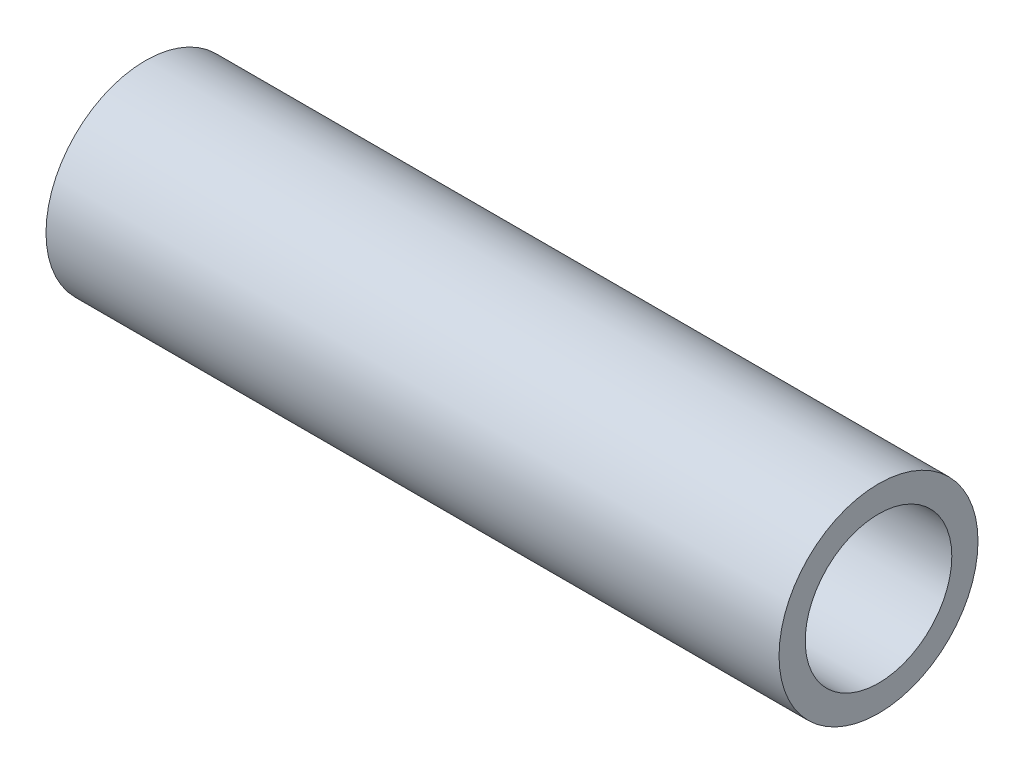
ISO-10303-21;
HEADER;
FILE_DESCRIPTION(('STEP AP214'),'2;1');
FILE_NAME('part.step','',(''),(''),'','','');
FILE_SCHEMA(('AUTOMOTIVE_DESIGN { 1 0 10303 214 1 1 1 1 }'));
ENDSEC;
DATA;
#1=APPLICATION_CONTEXT('core data for automotive mechanical design processes');
#2=APPLICATION_PROTOCOL_DEFINITION('international standard','automotive_design',2000,#1);
#3=PRODUCT_CONTEXT('',#1,'mechanical');
#4=PRODUCT('Part','Part','',(#3));
#5=PRODUCT_RELATED_PRODUCT_CATEGORY('part','',(#4));
#6=PRODUCT_DEFINITION_FORMATION('','',#4);
#7=PRODUCT_DEFINITION_CONTEXT('part definition',#1,'design');
#8=PRODUCT_DEFINITION('design','',#6,#7);
#9=PRODUCT_DEFINITION_SHAPE('','',#8);
#10=(LENGTH_UNIT() NAMED_UNIT(*) SI_UNIT(.MILLI.,.METRE.));
#11=(NAMED_UNIT(*) PLANE_ANGLE_UNIT() SI_UNIT($,.RADIAN.));
#12=(NAMED_UNIT(*) SI_UNIT($,.STERADIAN.) SOLID_ANGLE_UNIT());
#13=UNCERTAINTY_MEASURE_WITH_UNIT(LENGTH_MEASURE(1.E-05),#10,'distance_accuracy_value','');
#14=(GEOMETRIC_REPRESENTATION_CONTEXT(3) GLOBAL_UNCERTAINTY_ASSIGNED_CONTEXT((#13)) GLOBAL_UNIT_ASSIGNED_CONTEXT((#10,
#11,#12)) REPRESENTATION_CONTEXT('',''));
#15=CARTESIAN_POINT('',(0.,0.,0.));
#16=DIRECTION('',(0.,0.,1.));
#17=DIRECTION('',(1.,0.,0.));
#18=AXIS2_PLACEMENT_3D('',#15,#16,#17);
#19=CARTESIAN_POINT('',(71.12,0.,0.));
#20=DIRECTION('',(1.,0.,0.));
#21=DIRECTION('',(0.,0.,-1.));
#22=AXIS2_PLACEMENT_3D('',#19,#20,#21);
#23=PLANE('',#22);
#24=CARTESIAN_POINT('',(71.12,0.,0.));
#25=DIRECTION('',(1.,0.,0.));
#26=DIRECTION('',(0.,0.,-1.));
#27=AXIS2_PLACEMENT_3D('',#24,#25,#26);
#28=CIRCLE('',#27,9.652);
#29=CARTESIAN_POINT('',(71.12,0.,-9.652));
#30=VERTEX_POINT('',#29);
#31=EDGE_CURVE('E10',#30,#30,#28,.T.);
#32=ORIENTED_EDGE('',*,*,#31,.T.);
#33=EDGE_LOOP('',(#32));
#34=FACE_BOUND('',#33,.T.);
#35=CARTESIAN_POINT('',(71.12,0.,0.));
#36=DIRECTION('',(1.,0.,0.));
#37=DIRECTION('',(0.,0.,-1.));
#38=AXIS2_PLACEMENT_3D('',#35,#36,#37);
#39=CIRCLE('',#38,7.112);
#40=CARTESIAN_POINT('',(71.12,0.,-7.112));
#41=VERTEX_POINT('',#40);
#42=EDGE_CURVE('E43',#41,#41,#39,.T.);
#43=ORIENTED_EDGE('',*,*,#42,.F.);
#44=EDGE_LOOP('',(#43));
#45=FACE_BOUND('',#44,.T.);
#46=ADVANCED_FACE('F32',(#34,#45),#23,.T.);
#47=CARTESIAN_POINT('',(0.,0.,0.));
#48=DIRECTION('',(1.,0.,0.));
#49=DIRECTION('',(0.,0.,-1.));
#50=AXIS2_PLACEMENT_3D('',#47,#48,#49);
#51=PLANE('',#50);
#52=CARTESIAN_POINT('',(0.,0.,0.));
#53=DIRECTION('',(1.,0.,0.));
#54=DIRECTION('',(0.,0.,-1.));
#55=AXIS2_PLACEMENT_3D('',#52,#53,#54);
#56=CIRCLE('',#55,9.652);
#57=CARTESIAN_POINT('',(0.,0.,-9.652));
#58=VERTEX_POINT('',#57);
#59=EDGE_CURVE('E36',#58,#58,#56,.T.);
#60=ORIENTED_EDGE('',*,*,#59,.F.);
#61=EDGE_LOOP('',(#60));
#62=FACE_BOUND('',#61,.T.);
#63=CARTESIAN_POINT('',(0.,0.,0.));
#64=DIRECTION('',(1.,0.,0.));
#65=DIRECTION('',(0.,0.,-1.));
#66=AXIS2_PLACEMENT_3D('',#63,#64,#65);
#67=CIRCLE('',#66,7.112);
#68=CARTESIAN_POINT('',(0.,0.,-7.112));
#69=VERTEX_POINT('',#68);
#70=EDGE_CURVE('E45',#69,#69,#67,.T.);
#71=ORIENTED_EDGE('',*,*,#70,.T.);
#72=EDGE_LOOP('',(#71));
#73=FACE_BOUND('',#72,.T.);
#74=ADVANCED_FACE('F55',(#62,#73),#51,.F.);
#75=CARTESIAN_POINT('',(71.12,0.,0.));
#76=DIRECTION('',(-1.,0.,0.));
#77=DIRECTION('',(0.,0.,1.));
#78=AXIS2_PLACEMENT_3D('',#75,#76,#77);
#79=CYLINDRICAL_SURFACE('',#78,9.652);
#80=ORIENTED_EDGE('',*,*,#31,.F.);
#81=EDGE_LOOP('',(#80));
#82=FACE_BOUND('',#81,.T.);
#83=ORIENTED_EDGE('',*,*,#59,.T.);
#84=EDGE_LOOP('',(#83));
#85=FACE_BOUND('',#84,.T.);
#86=ADVANCED_FACE('F34',(#82,#85),#79,.T.);
#87=CARTESIAN_POINT('',(71.12,0.,0.));
#88=DIRECTION('',(-1.,0.,0.));
#89=DIRECTION('',(0.,0.,1.));
#90=AXIS2_PLACEMENT_3D('',#87,#88,#89);
#91=CYLINDRICAL_SURFACE('',#90,7.112);
#92=ORIENTED_EDGE('',*,*,#42,.T.);
#93=EDGE_LOOP('',(#92));
#94=FACE_BOUND('',#93,.T.);
#95=ORIENTED_EDGE('',*,*,#70,.F.);
#96=EDGE_LOOP('',(#95));
#97=FACE_BOUND('',#96,.T.);
#98=ADVANCED_FACE('F51',(#94,#97),#91,.F.);
#99=CLOSED_SHELL('',(#46,#74,#86,#98));
#100=MANIFOLD_SOLID_BREP('B2',#99);
#101=ADVANCED_BREP_SHAPE_REPRESENTATION('',(#18,#100),#14);
#102=SHAPE_DEFINITION_REPRESENTATION(#9,#101);
ENDSEC;
END-ISO-10303-21;
